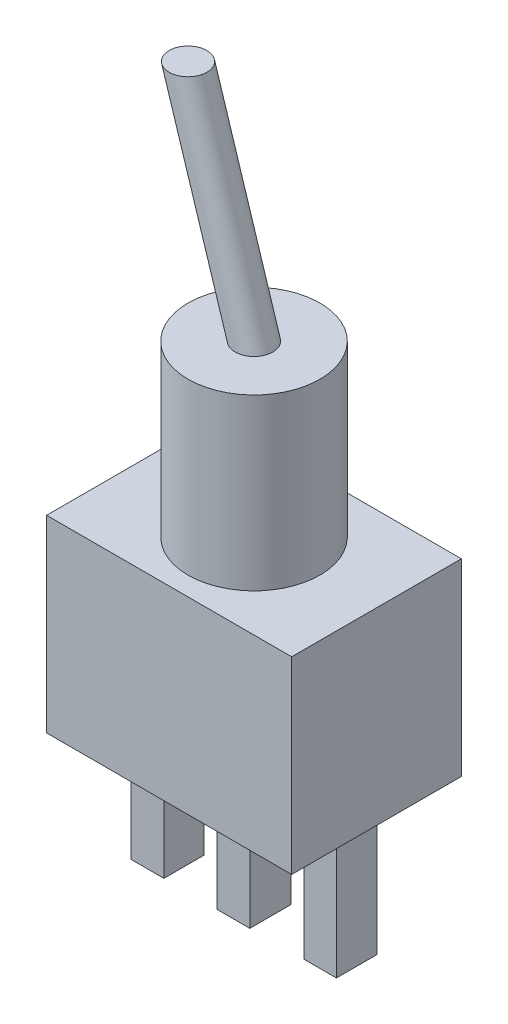
ISO-10303-21;
HEADER;
FILE_DESCRIPTION(('STEP AP214'),'2;1');
FILE_NAME('part.step','',(''),(''),'','','');
FILE_SCHEMA(('AUTOMOTIVE_DESIGN { 1 0 10303 214 1 1 1 1 }'));
ENDSEC;
DATA;
#1=APPLICATION_CONTEXT('core data for automotive mechanical design processes');
#2=APPLICATION_PROTOCOL_DEFINITION('international standard','automotive_design',2000,#1);
#3=PRODUCT_CONTEXT('',#1,'mechanical');
#4=PRODUCT('Part','Part','',(#3));
#5=PRODUCT_RELATED_PRODUCT_CATEGORY('part','',(#4));
#6=PRODUCT_DEFINITION_FORMATION('','',#4);
#7=PRODUCT_DEFINITION_CONTEXT('part definition',#1,'design');
#8=PRODUCT_DEFINITION('design','',#6,#7);
#9=PRODUCT_DEFINITION_SHAPE('','',#8);
#10=(LENGTH_UNIT() NAMED_UNIT(*) SI_UNIT(.MILLI.,.METRE.));
#11=(NAMED_UNIT(*) PLANE_ANGLE_UNIT() SI_UNIT($,.RADIAN.));
#12=(NAMED_UNIT(*) SI_UNIT($,.STERADIAN.) SOLID_ANGLE_UNIT());
#13=UNCERTAINTY_MEASURE_WITH_UNIT(LENGTH_MEASURE(1.E-05),#10,'distance_accuracy_value','');
#14=(GEOMETRIC_REPRESENTATION_CONTEXT(3) GLOBAL_UNCERTAINTY_ASSIGNED_CONTEXT((#13)) GLOBAL_UNIT_ASSIGNED_CONTEXT((#10,
#11,#12)) REPRESENTATION_CONTEXT('',''));
#15=CARTESIAN_POINT('',(0.,0.,0.));
#16=DIRECTION('',(0.,0.,1.));
#17=DIRECTION('',(1.,0.,0.));
#18=AXIS2_PLACEMENT_3D('',#15,#16,#17);
#19=CARTESIAN_POINT('',(0.,0.,0.));
#20=DIRECTION('',(0.,1.,0.));
#21=DIRECTION('',(0.,0.,1.));
#22=AXIS2_PLACEMENT_3D('',#19,#20,#21);
#23=PLANE('',#22);
#24=DIRECTION('',(0.,0.,1.));
#25=VECTOR('',#24,1.);
#26=CARTESIAN_POINT('',(-3.71007204412239,0.,1.06976152914244));
#27=LINE('',#26,#25);
#28=CARTESIAN_POINT('',(-3.71007204412239,0.,-1.06976152914244));
#29=VERTEX_POINT('',#28);
#30=CARTESIAN_POINT('',(-3.71007204412239,0.,1.06976152914244));
#31=VERTEX_POINT('',#30);
#32=EDGE_CURVE('E171',#29,#31,#27,.T.);
#33=ORIENTED_EDGE('',*,*,#32,.F.);
#34=DIRECTION('',(1.,0.,0.));
#35=VECTOR('',#34,1.);
#36=CARTESIAN_POINT('',(-3.71007204412239,0.,-1.06976152914244));
#37=LINE('',#36,#35);
#38=CARTESIAN_POINT('',(-5.44316480419965,0.,-1.06976152914244));
#39=VERTEX_POINT('',#38);
#40=EDGE_CURVE('E184',#39,#29,#37,.T.);
#41=ORIENTED_EDGE('',*,*,#40,.F.);
#42=DIRECTION('',(0.,0.,-1.));
#43=VECTOR('',#42,1.);
#44=CARTESIAN_POINT('',(-5.44316480419965,0.,1.06976152914244));
#45=LINE('',#44,#43);
#46=CARTESIAN_POINT('',(-5.44316480419965,0.,1.06976152914244));
#47=VERTEX_POINT('',#46);
#48=EDGE_CURVE('E193',#47,#39,#45,.T.);
#49=ORIENTED_EDGE('',*,*,#48,.F.);
#50=DIRECTION('',(-1.,0.,0.));
#51=VECTOR('',#50,1.);
#52=CARTESIAN_POINT('',(-3.71007204412239,0.,1.06976152914244));
#53=LINE('',#52,#51);
#54=EDGE_CURVE('E174',#31,#47,#53,.T.);
#55=ORIENTED_EDGE('',*,*,#54,.F.);
#56=EDGE_LOOP('',(#33,#41,#49,#55));
#57=FACE_BOUND('',#56,.T.);
#58=DIRECTION('',(0.,0.,-1.));
#59=VECTOR('',#58,1.);
#60=CARTESIAN_POINT('',(6.5,0.,-4.5));
#61=LINE('',#60,#59);
#62=CARTESIAN_POINT('',(6.5,0.,4.5));
#63=VERTEX_POINT('',#62);
#64=CARTESIAN_POINT('',(6.5,0.,-4.5));
#65=VERTEX_POINT('',#64);
#66=EDGE_CURVE('E248',#63,#65,#61,.T.);
#67=ORIENTED_EDGE('',*,*,#66,.F.);
#68=DIRECTION('',(1.,0.,0.));
#69=VECTOR('',#68,1.);
#70=CARTESIAN_POINT('',(-6.5,0.,4.5));
#71=LINE('',#70,#69);
#72=CARTESIAN_POINT('',(-6.5,0.,4.5));
#73=VERTEX_POINT('',#72);
#74=EDGE_CURVE('E255',#73,#63,#71,.T.);
#75=ORIENTED_EDGE('',*,*,#74,.F.);
#76=DIRECTION('',(0.,0.,1.));
#77=VECTOR('',#76,1.);
#78=CARTESIAN_POINT('',(-6.5,0.,-4.5));
#79=LINE('',#78,#77);
#80=CARTESIAN_POINT('',(-6.5,0.,-4.5));
#81=VERTEX_POINT('',#80);
#82=EDGE_CURVE('E266',#81,#73,#79,.T.);
#83=ORIENTED_EDGE('',*,*,#82,.F.);
#84=DIRECTION('',(-1.,0.,0.));
#85=VECTOR('',#84,1.);
#86=CARTESIAN_POINT('',(-6.5,0.,-4.5));
#87=LINE('',#86,#85);
#88=EDGE_CURVE('E264',#65,#81,#87,.T.);
#89=ORIENTED_EDGE('',*,*,#88,.F.);
#90=EDGE_LOOP('',(#67,#75,#83,#89));
#91=FACE_BOUND('',#90,.T.);
#92=DIRECTION('',(0.,0.,1.));
#93=VECTOR('',#92,1.);
#94=CARTESIAN_POINT('',(5.44316480419965,0.,1.06976152914244));
#95=LINE('',#94,#93);
#96=CARTESIAN_POINT('',(5.44316480419965,0.,-1.06976152914244));
#97=VERTEX_POINT('',#96);
#98=CARTESIAN_POINT('',(5.44316480419965,0.,1.06976152914244));
#99=VERTEX_POINT('',#98);
#100=EDGE_CURVE('E209',#97,#99,#95,.T.);
#101=ORIENTED_EDGE('',*,*,#100,.F.);
#102=DIRECTION('',(1.,0.,0.));
#103=VECTOR('',#102,1.);
#104=CARTESIAN_POINT('',(3.71007204412239,0.,-1.06976152914244));
#105=LINE('',#104,#103);
#106=CARTESIAN_POINT('',(3.71007204412239,0.,-1.06976152914244));
#107=VERTEX_POINT('',#106);
#108=EDGE_CURVE('E214',#107,#97,#105,.T.);
#109=ORIENTED_EDGE('',*,*,#108,.F.);
#110=DIRECTION('',(0.,0.,-1.));
#111=VECTOR('',#110,1.);
#112=CARTESIAN_POINT('',(3.71007204412239,0.,1.06976152914244));
#113=LINE('',#112,#111);
#114=CARTESIAN_POINT('',(3.71007204412239,0.,1.06976152914244));
#115=VERTEX_POINT('',#114);
#116=EDGE_CURVE('E226',#115,#107,#113,.T.);
#117=ORIENTED_EDGE('',*,*,#116,.F.);
#118=DIRECTION('',(-1.,0.,0.));
#119=VECTOR('',#118,1.);
#120=CARTESIAN_POINT('',(3.71007204412239,0.,1.06976152914244));
#121=LINE('',#120,#119);
#122=EDGE_CURVE('E223',#99,#115,#121,.T.);
#123=ORIENTED_EDGE('',*,*,#122,.F.);
#124=EDGE_LOOP('',(#101,#109,#117,#123));
#125=FACE_BOUND('',#124,.T.);
#126=DIRECTION('',(0.,0.,1.));
#127=VECTOR('',#126,1.);
#128=CARTESIAN_POINT('',(0.864683341182707,0.,1.08737475153483));
#129=LINE('',#128,#127);
#130=CARTESIAN_POINT('',(0.864683341182707,0.,-1.08737475153483));
#131=VERTEX_POINT('',#130);
#132=CARTESIAN_POINT('',(0.864683341182707,0.,1.08737475153483));
#133=VERTEX_POINT('',#132);
#134=EDGE_CURVE('E170',#131,#133,#129,.T.);
#135=ORIENTED_EDGE('',*,*,#134,.F.);
#136=DIRECTION('',(1.,0.,0.));
#137=VECTOR('',#136,1.);
#138=CARTESIAN_POINT('',(-0.864683341182707,0.,-1.08737475153483));
#139=LINE('',#138,#137);
#140=CARTESIAN_POINT('',(-0.864683341182707,0.,-1.08737475153483));
#141=VERTEX_POINT('',#140);
#142=EDGE_CURVE('E167',#141,#131,#139,.T.);
#143=ORIENTED_EDGE('',*,*,#142,.F.);
#144=DIRECTION('',(0.,0.,-1.));
#145=VECTOR('',#144,1.);
#146=CARTESIAN_POINT('',(-0.864683341182707,0.,1.08737475153483));
#147=LINE('',#146,#145);
#148=CARTESIAN_POINT('',(-0.864683341182707,0.,1.08737475153483));
#149=VERTEX_POINT('',#148);
#150=EDGE_CURVE('E57',#149,#141,#147,.T.);
#151=ORIENTED_EDGE('',*,*,#150,.F.);
#152=DIRECTION('',(-1.,0.,0.));
#153=VECTOR('',#152,1.);
#154=CARTESIAN_POINT('',(-0.864683341182707,0.,1.08737475153483));
#155=LINE('',#154,#153);
#156=EDGE_CURVE('E52',#133,#149,#155,.T.);
#157=ORIENTED_EDGE('',*,*,#156,.F.);
#158=EDGE_LOOP('',(#135,#143,#151,#157));
#159=FACE_BOUND('',#158,.T.);
#160=ADVANCED_FACE('F35',(#57,#91,#125,#159),#23,.F.);
#161=CARTESIAN_POINT('',(6.5,10.,-4.5));
#162=DIRECTION('',(-1.,0.,0.));
#163=DIRECTION('',(0.,0.,1.));
#164=AXIS2_PLACEMENT_3D('',#161,#162,#163);
#165=PLANE('',#164);
#166=ORIENTED_EDGE('',*,*,#66,.T.);
#167=DIRECTION('',(0.,-1.,0.));
#168=VECTOR('',#167,1.);
#169=CARTESIAN_POINT('',(6.5,10.,-4.5));
#170=LINE('',#169,#168);
#171=CARTESIAN_POINT('',(6.5,10.,-4.5));
#172=VERTEX_POINT('',#171);
#173=EDGE_CURVE('E39',#172,#65,#170,.T.);
#174=ORIENTED_EDGE('',*,*,#173,.F.);
#175=DIRECTION('',(0.,0.,-1.));
#176=VECTOR('',#175,1.);
#177=CARTESIAN_POINT('',(6.5,10.,-4.5));
#178=LINE('',#177,#176);
#179=CARTESIAN_POINT('',(6.5,10.,4.5));
#180=VERTEX_POINT('',#179);
#181=EDGE_CURVE('E251',#180,#172,#178,.T.);
#182=ORIENTED_EDGE('',*,*,#181,.F.);
#183=DIRECTION('',(0.,-1.,0.));
#184=VECTOR('',#183,1.);
#185=CARTESIAN_POINT('',(6.5,10.,4.5));
#186=LINE('',#185,#184);
#187=EDGE_CURVE('E261',#180,#63,#186,.T.);
#188=ORIENTED_EDGE('',*,*,#187,.T.);
#189=EDGE_LOOP('',(#166,#174,#182,#188));
#190=FACE_BOUND('',#189,.T.);
#191=ADVANCED_FACE('F37',(#190),#165,.F.);
#192=CARTESIAN_POINT('',(-6.5,10.,-4.5));
#193=DIRECTION('',(0.,0.,1.));
#194=DIRECTION('',(1.,0.,0.));
#195=AXIS2_PLACEMENT_3D('',#192,#193,#194);
#196=PLANE('',#195);
#197=ORIENTED_EDGE('',*,*,#88,.T.);
#198=DIRECTION('',(0.,-1.,0.));
#199=VECTOR('',#198,1.);
#200=CARTESIAN_POINT('',(-6.5,10.,-4.5));
#201=LINE('',#200,#199);
#202=CARTESIAN_POINT('',(-6.5,10.,-4.5));
#203=VERTEX_POINT('',#202);
#204=EDGE_CURVE('E273',#203,#81,#201,.T.);
#205=ORIENTED_EDGE('',*,*,#204,.F.);
#206=DIRECTION('',(-1.,0.,0.));
#207=VECTOR('',#206,1.);
#208=CARTESIAN_POINT('',(-6.5,10.,-4.5));
#209=LINE('',#208,#207);
#210=EDGE_CURVE('E254',#172,#203,#209,.T.);
#211=ORIENTED_EDGE('',*,*,#210,.F.);
#212=ORIENTED_EDGE('',*,*,#173,.T.);
#213=EDGE_LOOP('',(#197,#205,#211,#212));
#214=FACE_BOUND('',#213,.T.);
#215=ADVANCED_FACE('F282',(#214),#196,.F.);
#216=CARTESIAN_POINT('',(-6.5,10.,-4.5));
#217=DIRECTION('',(1.,0.,0.));
#218=DIRECTION('',(0.,0.,-1.));
#219=AXIS2_PLACEMENT_3D('',#216,#217,#218);
#220=PLANE('',#219);
#221=ORIENTED_EDGE('',*,*,#82,.T.);
#222=DIRECTION('',(0.,-1.,0.));
#223=VECTOR('',#222,1.);
#224=CARTESIAN_POINT('',(-6.5,10.,4.5));
#225=LINE('',#224,#223);
#226=CARTESIAN_POINT('',(-6.5,10.,4.5));
#227=VERTEX_POINT('',#226);
#228=EDGE_CURVE('E271',#227,#73,#225,.T.);
#229=ORIENTED_EDGE('',*,*,#228,.F.);
#230=DIRECTION('',(0.,0.,1.));
#231=VECTOR('',#230,1.);
#232=CARTESIAN_POINT('',(-6.5,10.,-4.5));
#233=LINE('',#232,#231);
#234=EDGE_CURVE('E257',#203,#227,#233,.T.);
#235=ORIENTED_EDGE('',*,*,#234,.F.);
#236=ORIENTED_EDGE('',*,*,#204,.T.);
#237=EDGE_LOOP('',(#221,#229,#235,#236));
#238=FACE_BOUND('',#237,.T.);
#239=ADVANCED_FACE('F291',(#238),#220,.F.);
#240=CARTESIAN_POINT('',(-6.5,10.,4.5));
#241=DIRECTION('',(0.,0.,-1.));
#242=DIRECTION('',(-1.,0.,0.));
#243=AXIS2_PLACEMENT_3D('',#240,#241,#242);
#244=PLANE('',#243);
#245=ORIENTED_EDGE('',*,*,#74,.T.);
#246=ORIENTED_EDGE('',*,*,#187,.F.);
#247=DIRECTION('',(1.,0.,0.));
#248=VECTOR('',#247,1.);
#249=CARTESIAN_POINT('',(-6.5,10.,4.5));
#250=LINE('',#249,#248);
#251=EDGE_CURVE('E259',#227,#180,#250,.T.);
#252=ORIENTED_EDGE('',*,*,#251,.F.);
#253=ORIENTED_EDGE('',*,*,#228,.T.);
#254=EDGE_LOOP('',(#245,#246,#252,#253));
#255=FACE_BOUND('',#254,.T.);
#256=ADVANCED_FACE('F294',(#255),#244,.F.);
#257=CARTESIAN_POINT('',(0.,10.,0.));
#258=DIRECTION('',(0.,1.,0.));
#259=DIRECTION('',(0.,0.,1.));
#260=AXIS2_PLACEMENT_3D('',#257,#258,#259);
#261=PLANE('',#260);
#262=CARTESIAN_POINT('',(0.,10.,0.));
#263=DIRECTION('',(0.,1.,0.));
#264=DIRECTION('',(0.,0.,1.));
#265=AXIS2_PLACEMENT_3D('',#262,#263,#264);
#266=CIRCLE('',#265,3.5);
#267=CARTESIAN_POINT('',(0.,10.,3.5));
#268=VERTEX_POINT('',#267);
#269=EDGE_CURVE('E44',#268,#268,#266,.T.);
#270=ORIENTED_EDGE('',*,*,#269,.F.);
#271=EDGE_LOOP('',(#270));
#272=FACE_BOUND('',#271,.T.);
#273=ORIENTED_EDGE('',*,*,#181,.T.);
#274=ORIENTED_EDGE('',*,*,#210,.T.);
#275=ORIENTED_EDGE('',*,*,#234,.T.);
#276=ORIENTED_EDGE('',*,*,#251,.T.);
#277=EDGE_LOOP('',(#273,#274,#275,#276));
#278=FACE_BOUND('',#277,.T.);
#279=ADVANCED_FACE('F296',(#272,#278),#261,.T.);
#280=CARTESIAN_POINT('',(0.,19.,0.));
#281=DIRECTION('',(0.,-1.,0.));
#282=DIRECTION('',(0.,0.,-1.));
#283=AXIS2_PLACEMENT_3D('',#280,#281,#282);
#284=CYLINDRICAL_SURFACE('',#283,3.5);
#285=CARTESIAN_POINT('',(0.,19.,0.));
#286=DIRECTION('',(0.,1.,0.));
#287=DIRECTION('',(0.,0.,1.));
#288=AXIS2_PLACEMENT_3D('',#285,#286,#287);
#289=CIRCLE('',#288,3.5);
#290=CARTESIAN_POINT('',(0.,19.,3.5));
#291=VERTEX_POINT('',#290);
#292=EDGE_CURVE('E245',#291,#291,#289,.T.);
#293=ORIENTED_EDGE('',*,*,#292,.F.);
#294=EDGE_LOOP('',(#293));
#295=FACE_BOUND('',#294,.T.);
#296=ORIENTED_EDGE('',*,*,#269,.T.);
#297=EDGE_LOOP('',(#296));
#298=FACE_BOUND('',#297,.T.);
#299=ADVANCED_FACE('F298',(#295,#298),#284,.T.);
#300=CARTESIAN_POINT('',(0.,19.,0.));
#301=DIRECTION('',(0.,1.,0.));
#302=DIRECTION('',(0.,0.,1.));
#303=AXIS2_PLACEMENT_3D('',#300,#301,#302);
#304=PLANE('',#303);
#305=CARTESIAN_POINT('',(0.,19.,0.));
#306=DIRECTION('',(0.,1.,0.));
#307=DIRECTION('',(0.,0.,1.));
#308=AXIS2_PLACEMENT_3D('',#305,#306,#307);
#309=CIRCLE('',#308,1.);
#310=CARTESIAN_POINT('',(0.,19.,1.));
#311=VERTEX_POINT('',#310);
#312=EDGE_CURVE('E11',#311,#311,#309,.T.);
#313=ORIENTED_EDGE('',*,*,#312,.F.);
#314=EDGE_LOOP('',(#313));
#315=FACE_BOUND('',#314,.T.);
#316=ORIENTED_EDGE('',*,*,#292,.T.);
#317=EDGE_LOOP('',(#316));
#318=FACE_BOUND('',#317,.T.);
#319=ADVANCED_FACE('F305',(#315,#318),#304,.T.);
#320=CARTESIAN_POINT('',(-3.5,30.1002056575858,0.));
#321=DIRECTION('',(0.,1.,0.));
#322=DIRECTION('',(0.,0.,1.));
#323=AXIS2_PLACEMENT_3D('',#320,#321,#322);
#324=PLANE('',#323);
#325=CARTESIAN_POINT('',(-3.5,30.1002056575858,0.));
#326=DIRECTION('',(0.,1.,0.));
#327=DIRECTION('',(0.,0.,1.));
#328=AXIS2_PLACEMENT_3D('',#325,#326,#327);
#329=CIRCLE('',#328,1.);
#330=CARTESIAN_POINT('',(-3.5,30.1002056575858,1.));
#331=VERTEX_POINT('',#330);
#332=EDGE_CURVE('E241',#331,#331,#329,.T.);
#333=ORIENTED_EDGE('',*,*,#332,.T.);
#334=EDGE_LOOP('',(#333));
#335=FACE_BOUND('',#334,.T.);
#336=ADVANCED_FACE('F352',(#335),#324,.T.);
#337=CARTESIAN_POINT('',(0.,19.,1.));
#338=CARTESIAN_POINT('',(-3.5,30.1002056575858,1.));
#339=CARTESIAN_POINT('',(2.,19.,1.));
#340=CARTESIAN_POINT('',(-1.5,30.1002056575858,1.));
#341=CARTESIAN_POINT('',(2.,19.,-1.));
#342=CARTESIAN_POINT('',(-1.5,30.1002056575858,-1.));
#343=CARTESIAN_POINT('',(0.,19.,-1.));
#344=CARTESIAN_POINT('',(-3.5,30.1002056575858,-1.));
#345=CARTESIAN_POINT('',(-2.,19.,-1.));
#346=CARTESIAN_POINT('',(-5.5,30.1002056575858,-1.));
#347=CARTESIAN_POINT('',(-2.,19.,1.));
#348=CARTESIAN_POINT('',(-5.5,30.1002056575858,1.));
#349=CARTESIAN_POINT('',(0.,19.,1.));
#350=CARTESIAN_POINT('',(-3.5,30.1002056575858,1.));
#351=(BOUNDED_SURFACE() B_SPLINE_SURFACE(3,1,((#337,#338),(#339,#340),(#341,#342),(#343,#344),
(#345,#346),(#347,#348),(#349,#350)),.UNSPECIFIED.,.T.,.F.,.F.) B_SPLINE_SURFACE_WITH_KNOTS((4,
3,4),(2,2),(0.,0.5,1.),(0.,1.),
.UNSPECIFIED.) GEOMETRIC_REPRESENTATION_ITEM() RATIONAL_B_SPLINE_SURFACE(((1.,1.),
(0.333333333333333,0.333333333333333),(0.333333333333333,0.333333333333333),(1.,1.),
(0.333333333333333,0.333333333333333),(0.333333333333333,0.333333333333333),(1.,1.))) REPRESENTATION_ITEM('') SURFACE());
#352=CARTESIAN_POINT('',(-3.5,30.1002056575858,1.));
#353=CARTESIAN_POINT('',(-3.46354166666667,29.9845785153193,1.));
#354=CARTESIAN_POINT('',(-3.42708333333333,29.8689513730528,1.));
#355=CARTESIAN_POINT('',(-3.35416666666667,29.6376970885198,1.));
#356=CARTESIAN_POINT('',(-3.31770833333333,29.5220699462532,1.));
#357=CARTESIAN_POINT('',(-3.24479166666667,29.2908156617202,1.));
#358=CARTESIAN_POINT('',(-3.20833333333333,29.1751885194537,1.));
#359=CARTESIAN_POINT('',(-3.13541666666667,28.9439342349206,1.));
#360=CARTESIAN_POINT('',(-3.09895833333333,28.8283070926541,1.));
#361=CARTESIAN_POINT('',(-3.02604166666667,28.5970528081211,1.));
#362=CARTESIAN_POINT('',(-2.98958333333333,28.4814256658546,1.));
#363=CARTESIAN_POINT('',(-2.91666666666667,28.2501713813215,1.));
#364=CARTESIAN_POINT('',(-2.88020833333333,28.134544239055,1.));
#365=CARTESIAN_POINT('',(-2.80729166666667,27.903289954522,1.));
#366=CARTESIAN_POINT('',(-2.77083333333333,27.7876628122555,1.));
#367=CARTESIAN_POINT('',(-2.69791666666667,27.5564085277224,1.));
#368=CARTESIAN_POINT('',(-2.66145833333333,27.4407813854559,1.));
#369=CARTESIAN_POINT('',(-2.58854166666667,27.2095271009229,1.));
#370=CARTESIAN_POINT('',(-2.55208333333333,27.0938999586563,1.));
#371=CARTESIAN_POINT('',(-2.47916666666667,26.8626456741233,1.));
#372=CARTESIAN_POINT('',(-2.44270833333333,26.7470185318568,1.));
#373=CARTESIAN_POINT('',(-2.36979166666667,26.5157642473237,1.));
#374=CARTESIAN_POINT('',(-2.33333333333333,26.4001371050572,1.));
#375=CARTESIAN_POINT('',(-2.26041666666667,26.1688828205242,1.));
#376=CARTESIAN_POINT('',(-2.22395833333333,26.0532556782577,1.));
#377=CARTESIAN_POINT('',(-2.15104166666667,25.8220013937246,1.));
#378=CARTESIAN_POINT('',(-2.11458333333333,25.7063742514581,1.));
#379=CARTESIAN_POINT('',(-2.04166666666667,25.4751199669251,1.));
#380=CARTESIAN_POINT('',(-2.00520833333333,25.3594928246586,1.));
#381=CARTESIAN_POINT('',(-1.93229166666667,25.1282385401255,1.));
#382=CARTESIAN_POINT('',(-1.89583333333333,25.012611397859,1.));
#383=CARTESIAN_POINT('',(-1.82291666666667,24.781357113326,1.));
#384=CARTESIAN_POINT('',(-1.78645833333333,24.6657299710594,1.));
#385=CARTESIAN_POINT('',(-1.71354166666667,24.4344756865264,1.));
#386=CARTESIAN_POINT('',(-1.67708333333333,24.3188485442599,1.));
#387=CARTESIAN_POINT('',(-1.60416666666667,24.0875942597268,1.));
#388=CARTESIAN_POINT('',(-1.56770833333333,23.9719671174603,1.));
#389=CARTESIAN_POINT('',(-1.49479166666667,23.7407128329273,1.));
#390=CARTESIAN_POINT('',(-1.45833333333333,23.6250856906608,1.));
#391=CARTESIAN_POINT('',(-1.38541666666667,23.3938314061277,1.));
#392=CARTESIAN_POINT('',(-1.34895833333333,23.2782042638612,1.));
#393=CARTESIAN_POINT('',(-1.27604166666667,23.0469499793282,1.));
#394=CARTESIAN_POINT('',(-1.23958333333333,22.9313228370616,1.));
#395=CARTESIAN_POINT('',(-1.16666666666667,22.7000685525286,1.));
#396=CARTESIAN_POINT('',(-1.13020833333333,22.5844414102621,1.));
#397=CARTESIAN_POINT('',(-1.05729166666667,22.3531871257291,1.));
#398=CARTESIAN_POINT('',(-1.02083333333333,22.2375599834625,1.));
#399=CARTESIAN_POINT('',(-0.947916666666666,22.0063056989295,1.));
#400=CARTESIAN_POINT('',(-0.911458333333333,21.890678556663,1.));
#401=CARTESIAN_POINT('',(-0.838541666666667,21.6594242721299,1.));
#402=CARTESIAN_POINT('',(-0.802083333333333,21.5437971298634,1.));
#403=CARTESIAN_POINT('',(-0.729166666666667,21.3125428453304,1.));
#404=CARTESIAN_POINT('',(-0.692708333333334,21.1969157030639,1.));
#405=CARTESIAN_POINT('',(-0.619791666666667,20.9656614185308,1.));
#406=CARTESIAN_POINT('',(-0.583333333333333,20.8500342762643,1.));
#407=CARTESIAN_POINT('',(-0.510416666666666,20.6187799917313,1.));
#408=CARTESIAN_POINT('',(-0.473958333333333,20.5031528494647,1.));
#409=CARTESIAN_POINT('',(-0.401041666666667,20.2718985649317,1.));
#410=CARTESIAN_POINT('',(-0.364583333333333,20.1562714226652,1.));
#411=CARTESIAN_POINT('',(-0.291666666666667,19.9250171381322,1.));
#412=CARTESIAN_POINT('',(-0.255208333333334,19.8093899958656,1.));
#413=CARTESIAN_POINT('',(-0.182291666666667,19.5781357113326,1.));
#414=CARTESIAN_POINT('',(-0.145833333333333,19.4625085690661,1.));
#415=CARTESIAN_POINT('',(-0.0729166666666664,19.231254284533,1.));
#416=CARTESIAN_POINT('',(-0.0364583333333329,19.1156271422665,1.));
#417=CARTESIAN_POINT('',(0.,19.,1.));
#418=B_SPLINE_CURVE_WITH_KNOTS('',3,(#352,#353,#354,#355,#356,#357,#358,#359,#360,#361,#362,
#363,#364,#365,#366,#367,#368,#369,#370,#371,#372,#373,#374,#375,#376,#377,#378,#379,#380,#381,
#382,#383,#384,#385,#386,#387,#388,#389,#390,#391,#392,#393,#394,#395,#396,#397,#398,#399,#400,
#401,#402,#403,#404,#405,#406,#407,#408,#409,#410,#411,#412,#413,#414,#415,#416,#417),
.UNSPECIFIED.,.F.,.F.,(4,2,2,2,2,2,2,2,2,2,2,2,2,2,2,2,2,2,2,2,2,2,2,2,2,2,2,2,2,2,2,2,4),(0.,
0.363716393476424,0.727432786952848,1.09114918042927,1.4548655739057,1.81858196738212,
2.18229836085854,2.54601475433496,2.90973114781139,3.27344754128781,3.63716393476424,
4.00088032824066,4.36459672171709,4.72831311519351,5.09202950866993,5.45574590214636,
5.81946229562278,6.18317868909921,6.54689508257563,6.91061147605205,7.27432786952848,
7.6380442630049,8.00176065648132,8.36547704995775,8.72919344343417,9.0929098369106,
9.45662623038702,9.82034262386344,10.1840590173399,10.5477754108163,10.9114918042927,
11.2752081977691,11.6389245912456),.UNSPECIFIED.);
#419=EDGE_CURVE('BSEAM355',#331,#311,#418,.T.);
#420=ORIENTED_EDGE('',*,*,#332,.F.);
#421=ORIENTED_EDGE('',*,*,#312,.T.);
#422=ORIENTED_EDGE('',*,*,#419,.T.);
#423=ORIENTED_EDGE('',*,*,#419,.F.);
#424=EDGE_LOOP('',(#420,#422,#421,#423));
#425=FACE_BOUND('',#424,.T.);
#426=ADVANCED_FACE('F355',(#425),#351,.T.);
#427=CARTESIAN_POINT('',(5.44316480419965,-7.,1.06976152914244));
#428=DIRECTION('',(-1.,0.,0.));
#429=DIRECTION('',(0.,0.,1.));
#430=AXIS2_PLACEMENT_3D('',#427,#428,#429);
#431=PLANE('',#430);
#432=ORIENTED_EDGE('',*,*,#100,.T.);
#433=DIRECTION('',(0.,1.,0.));
#434=VECTOR('',#433,1.);
#435=CARTESIAN_POINT('',(5.44316480419965,-7.,1.06976152914244));
#436=LINE('',#435,#434);
#437=CARTESIAN_POINT('',(5.44316480419965,-7.,1.06976152914244));
#438=VERTEX_POINT('',#437);
#439=EDGE_CURVE('E239',#438,#99,#436,.T.);
#440=ORIENTED_EDGE('',*,*,#439,.F.);
#441=DIRECTION('',(0.,0.,1.));
#442=VECTOR('',#441,1.);
#443=CARTESIAN_POINT('',(5.44316480419965,-7.,1.06976152914244));
#444=LINE('',#443,#442);
#445=CARTESIAN_POINT('',(5.44316480419965,-7.,-1.06976152914244));
#446=VERTEX_POINT('',#445);
#447=EDGE_CURVE('E210',#446,#438,#444,.T.);
#448=ORIENTED_EDGE('',*,*,#447,.F.);
#449=DIRECTION('',(0.,1.,0.));
#450=VECTOR('',#449,1.);
#451=CARTESIAN_POINT('',(5.44316480419965,-7.,-1.06976152914244));
#452=LINE('',#451,#450);
#453=EDGE_CURVE('E220',#446,#97,#452,.T.);
#454=ORIENTED_EDGE('',*,*,#453,.T.);
#455=EDGE_LOOP('',(#432,#440,#448,#454));
#456=FACE_BOUND('',#455,.T.);
#457=ADVANCED_FACE('F364',(#456),#431,.F.);
#458=CARTESIAN_POINT('',(3.71007204412239,-7.,1.06976152914244));
#459=DIRECTION('',(0.,0.,-1.));
#460=DIRECTION('',(-1.,0.,0.));
#461=AXIS2_PLACEMENT_3D('',#458,#459,#460);
#462=PLANE('',#461);
#463=ORIENTED_EDGE('',*,*,#122,.T.);
#464=DIRECTION('',(0.,1.,0.));
#465=VECTOR('',#464,1.);
#466=CARTESIAN_POINT('',(3.71007204412239,-7.,1.06976152914244));
#467=LINE('',#466,#465);
#468=CARTESIAN_POINT('',(3.71007204412239,-7.,1.06976152914244));
#469=VERTEX_POINT('',#468);
#470=EDGE_CURVE('E236',#469,#115,#467,.T.);
#471=ORIENTED_EDGE('',*,*,#470,.F.);
#472=DIRECTION('',(-1.,0.,0.));
#473=VECTOR('',#472,1.);
#474=CARTESIAN_POINT('',(3.71007204412239,-7.,1.06976152914244));
#475=LINE('',#474,#473);
#476=EDGE_CURVE('E213',#438,#469,#475,.T.);
#477=ORIENTED_EDGE('',*,*,#476,.F.);
#478=ORIENTED_EDGE('',*,*,#439,.T.);
#479=EDGE_LOOP('',(#463,#471,#477,#478));
#480=FACE_BOUND('',#479,.T.);
#481=ADVANCED_FACE('F384',(#480),#462,.F.);
#482=CARTESIAN_POINT('',(3.71007204412239,-7.,1.06976152914244));
#483=DIRECTION('',(1.,0.,0.));
#484=DIRECTION('',(0.,0.,-1.));
#485=AXIS2_PLACEMENT_3D('',#482,#483,#484);
#486=PLANE('',#485);
#487=ORIENTED_EDGE('',*,*,#116,.T.);
#488=DIRECTION('',(0.,1.,0.));
#489=VECTOR('',#488,1.);
#490=CARTESIAN_POINT('',(3.71007204412239,-7.,-1.06976152914244));
#491=LINE('',#490,#489);
#492=CARTESIAN_POINT('',(3.71007204412239,-7.,-1.06976152914244));
#493=VERTEX_POINT('',#492);
#494=EDGE_CURVE('E233',#493,#107,#491,.T.);
#495=ORIENTED_EDGE('',*,*,#494,.F.);
#496=DIRECTION('',(0.,0.,-1.));
#497=VECTOR('',#496,1.);
#498=CARTESIAN_POINT('',(3.71007204412239,-7.,1.06976152914244));
#499=LINE('',#498,#497);
#500=EDGE_CURVE('E216',#469,#493,#499,.T.);
#501=ORIENTED_EDGE('',*,*,#500,.F.);
#502=ORIENTED_EDGE('',*,*,#470,.T.);
#503=EDGE_LOOP('',(#487,#495,#501,#502));
#504=FACE_BOUND('',#503,.T.);
#505=ADVANCED_FACE('F391',(#504),#486,.F.);
#506=CARTESIAN_POINT('',(3.71007204412239,-7.,-1.06976152914244));
#507=DIRECTION('',(0.,0.,1.));
#508=DIRECTION('',(1.,0.,0.));
#509=AXIS2_PLACEMENT_3D('',#506,#507,#508);
#510=PLANE('',#509);
#511=ORIENTED_EDGE('',*,*,#108,.T.);
#512=ORIENTED_EDGE('',*,*,#453,.F.);
#513=DIRECTION('',(1.,0.,0.));
#514=VECTOR('',#513,1.);
#515=CARTESIAN_POINT('',(3.71007204412239,-7.,-1.06976152914244));
#516=LINE('',#515,#514);
#517=EDGE_CURVE('E218',#493,#446,#516,.T.);
#518=ORIENTED_EDGE('',*,*,#517,.F.);
#519=ORIENTED_EDGE('',*,*,#494,.T.);
#520=EDGE_LOOP('',(#511,#512,#518,#519));
#521=FACE_BOUND('',#520,.T.);
#522=ADVANCED_FACE('F399',(#521),#510,.F.);
#523=CARTESIAN_POINT('',(0.,-7.,0.));
#524=DIRECTION('',(0.,-1.,0.));
#525=DIRECTION('',(0.,0.,-1.));
#526=AXIS2_PLACEMENT_3D('',#523,#524,#525);
#527=PLANE('',#526);
#528=ORIENTED_EDGE('',*,*,#447,.T.);
#529=ORIENTED_EDGE('',*,*,#476,.T.);
#530=ORIENTED_EDGE('',*,*,#500,.T.);
#531=ORIENTED_EDGE('',*,*,#517,.T.);
#532=EDGE_LOOP('',(#528,#529,#530,#531));
#533=FACE_BOUND('',#532,.T.);
#534=ADVANCED_FACE('F407',(#533),#527,.T.);
#535=CARTESIAN_POINT('',(-3.71007204412239,-7.,1.06976152914244));
#536=DIRECTION('',(-1.,0.,0.));
#537=DIRECTION('',(0.,0.,1.));
#538=AXIS2_PLACEMENT_3D('',#535,#536,#537);
#539=PLANE('',#538);
#540=ORIENTED_EDGE('',*,*,#32,.T.);
#541=DIRECTION('',(0.,1.,0.));
#542=VECTOR('',#541,1.);
#543=CARTESIAN_POINT('',(-3.71007204412239,-7.,1.06976152914244));
#544=LINE('',#543,#542);
#545=CARTESIAN_POINT('',(-3.71007204412239,-7.,1.06976152914244));
#546=VERTEX_POINT('',#545);
#547=EDGE_CURVE('E206',#546,#31,#544,.T.);
#548=ORIENTED_EDGE('',*,*,#547,.F.);
#549=DIRECTION('',(0.,0.,1.));
#550=VECTOR('',#549,1.);
#551=CARTESIAN_POINT('',(-3.71007204412239,-7.,1.06976152914244));
#552=LINE('',#551,#550);
#553=CARTESIAN_POINT('',(-3.71007204412239,-7.,-1.06976152914244));
#554=VERTEX_POINT('',#553);
#555=EDGE_CURVE('E180',#554,#546,#552,.T.);
#556=ORIENTED_EDGE('',*,*,#555,.F.);
#557=DIRECTION('',(0.,1.,0.));
#558=VECTOR('',#557,1.);
#559=CARTESIAN_POINT('',(-3.71007204412239,-7.,-1.06976152914244));
#560=LINE('',#559,#558);
#561=EDGE_CURVE('E189',#554,#29,#560,.T.);
#562=ORIENTED_EDGE('',*,*,#561,.T.);
#563=EDGE_LOOP('',(#540,#548,#556,#562));
#564=FACE_BOUND('',#563,.T.);
#565=ADVANCED_FACE('F415',(#564),#539,.F.);
#566=CARTESIAN_POINT('',(-3.71007204412239,-7.,1.06976152914244));
#567=DIRECTION('',(0.,0.,-1.));
#568=DIRECTION('',(-1.,0.,0.));
#569=AXIS2_PLACEMENT_3D('',#566,#567,#568);
#570=PLANE('',#569);
#571=ORIENTED_EDGE('',*,*,#54,.T.);
#572=DIRECTION('',(0.,1.,0.));
#573=VECTOR('',#572,1.);
#574=CARTESIAN_POINT('',(-5.44316480419965,-7.,1.06976152914244));
#575=LINE('',#574,#573);
#576=CARTESIAN_POINT('',(-5.44316480419965,-7.,1.06976152914244));
#577=VERTEX_POINT('',#576);
#578=EDGE_CURVE('E203',#577,#47,#575,.T.);
#579=ORIENTED_EDGE('',*,*,#578,.F.);
#580=DIRECTION('',(-1.,0.,0.));
#581=VECTOR('',#580,1.);
#582=CARTESIAN_POINT('',(-3.71007204412239,-7.,1.06976152914244));
#583=LINE('',#582,#581);
#584=EDGE_CURVE('E183',#546,#577,#583,.T.);
#585=ORIENTED_EDGE('',*,*,#584,.F.);
#586=ORIENTED_EDGE('',*,*,#547,.T.);
#587=EDGE_LOOP('',(#571,#579,#585,#586));
#588=FACE_BOUND('',#587,.T.);
#589=ADVANCED_FACE('F423',(#588),#570,.F.);
#590=CARTESIAN_POINT('',(-5.44316480419965,-7.,1.06976152914244));
#591=DIRECTION('',(1.,0.,0.));
#592=DIRECTION('',(0.,0.,-1.));
#593=AXIS2_PLACEMENT_3D('',#590,#591,#592);
#594=PLANE('',#593);
#595=ORIENTED_EDGE('',*,*,#48,.T.);
#596=DIRECTION('',(0.,1.,0.));
#597=VECTOR('',#596,1.);
#598=CARTESIAN_POINT('',(-5.44316480419965,-7.,-1.06976152914244));
#599=LINE('',#598,#597);
#600=CARTESIAN_POINT('',(-5.44316480419965,-7.,-1.06976152914244));
#601=VERTEX_POINT('',#600);
#602=EDGE_CURVE('E200',#601,#39,#599,.T.);
#603=ORIENTED_EDGE('',*,*,#602,.F.);
#604=DIRECTION('',(0.,0.,-1.));
#605=VECTOR('',#604,1.);
#606=CARTESIAN_POINT('',(-5.44316480419965,-7.,1.06976152914244));
#607=LINE('',#606,#605);
#608=EDGE_CURVE('E186',#577,#601,#607,.T.);
#609=ORIENTED_EDGE('',*,*,#608,.F.);
#610=ORIENTED_EDGE('',*,*,#578,.T.);
#611=EDGE_LOOP('',(#595,#603,#609,#610));
#612=FACE_BOUND('',#611,.T.);
#613=ADVANCED_FACE('F431',(#612),#594,.F.);
#614=CARTESIAN_POINT('',(-3.71007204412239,-7.,-1.06976152914244));
#615=DIRECTION('',(0.,0.,1.));
#616=DIRECTION('',(1.,0.,0.));
#617=AXIS2_PLACEMENT_3D('',#614,#615,#616);
#618=PLANE('',#617);
#619=ORIENTED_EDGE('',*,*,#40,.T.);
#620=ORIENTED_EDGE('',*,*,#561,.F.);
#621=DIRECTION('',(1.,0.,0.));
#622=VECTOR('',#621,1.);
#623=CARTESIAN_POINT('',(-3.71007204412239,-7.,-1.06976152914244));
#624=LINE('',#623,#622);
#625=EDGE_CURVE('E188',#601,#554,#624,.T.);
#626=ORIENTED_EDGE('',*,*,#625,.F.);
#627=ORIENTED_EDGE('',*,*,#602,.T.);
#628=EDGE_LOOP('',(#619,#620,#626,#627));
#629=FACE_BOUND('',#628,.T.);
#630=ADVANCED_FACE('F439',(#629),#618,.F.);
#631=CARTESIAN_POINT('',(0.,-7.,0.));
#632=DIRECTION('',(0.,1.,0.));
#633=DIRECTION('',(0.,0.,1.));
#634=AXIS2_PLACEMENT_3D('',#631,#632,#633);
#635=PLANE('',#634);
#636=ORIENTED_EDGE('',*,*,#555,.T.);
#637=ORIENTED_EDGE('',*,*,#584,.T.);
#638=ORIENTED_EDGE('',*,*,#608,.T.);
#639=ORIENTED_EDGE('',*,*,#625,.T.);
#640=EDGE_LOOP('',(#636,#637,#638,#639));
#641=FACE_BOUND('',#640,.T.);
#642=ADVANCED_FACE('F447',(#641),#635,.F.);
#643=CARTESIAN_POINT('',(0.864683341182707,-7.,1.08737475153483));
#644=DIRECTION('',(-1.,0.,0.));
#645=DIRECTION('',(0.,0.,1.));
#646=AXIS2_PLACEMENT_3D('',#643,#644,#645);
#647=PLANE('',#646);
#648=ORIENTED_EDGE('',*,*,#134,.T.);
#649=DIRECTION('',(0.,1.,0.));
#650=VECTOR('',#649,1.);
#651=CARTESIAN_POINT('',(0.864683341182707,-7.,1.08737475153483));
#652=LINE('',#651,#650);
#653=CARTESIAN_POINT('',(0.864683341182707,-7.,1.08737475153483));
#654=VERTEX_POINT('',#653);
#655=EDGE_CURVE('E151',#654,#133,#652,.T.);
#656=ORIENTED_EDGE('',*,*,#655,.F.);
#657=DIRECTION('',(0.,0.,1.));
#658=VECTOR('',#657,1.);
#659=CARTESIAN_POINT('',(0.864683341182707,-7.,1.08737475153483));
#660=LINE('',#659,#658);
#661=CARTESIAN_POINT('',(0.864683341182707,-7.,-1.08737475153483));
#662=VERTEX_POINT('',#661);
#663=EDGE_CURVE('E158',#662,#654,#660,.T.);
#664=ORIENTED_EDGE('',*,*,#663,.F.);
#665=DIRECTION('',(0.,1.,0.));
#666=VECTOR('',#665,1.);
#667=CARTESIAN_POINT('',(0.864683341182707,-7.,-1.08737475153483));
#668=LINE('',#667,#666);
#669=EDGE_CURVE('E531',#662,#131,#668,.T.);
#670=ORIENTED_EDGE('',*,*,#669,.T.);
#671=EDGE_LOOP('',(#648,#656,#664,#670));
#672=FACE_BOUND('',#671,.T.);
#673=ADVANCED_FACE('F169',(#672),#647,.F.);
#674=CARTESIAN_POINT('',(-0.864683341182707,-7.,1.08737475153483));
#675=DIRECTION('',(0.,0.,-1.));
#676=DIRECTION('',(-1.,0.,0.));
#677=AXIS2_PLACEMENT_3D('',#674,#675,#676);
#678=PLANE('',#677);
#679=ORIENTED_EDGE('',*,*,#156,.T.);
#680=DIRECTION('',(0.,1.,0.));
#681=VECTOR('',#680,1.);
#682=CARTESIAN_POINT('',(-0.864683341182707,-7.,1.08737475153483));
#683=LINE('',#682,#681);
#684=CARTESIAN_POINT('',(-0.864683341182707,-7.,1.08737475153483));
#685=VERTEX_POINT('',#684);
#686=EDGE_CURVE('E154',#685,#149,#683,.T.);
#687=ORIENTED_EDGE('',*,*,#686,.F.);
#688=DIRECTION('',(-1.,0.,0.));
#689=VECTOR('',#688,1.);
#690=CARTESIAN_POINT('',(-0.864683341182707,-7.,1.08737475153483));
#691=LINE('',#690,#689);
#692=EDGE_CURVE('E147',#654,#685,#691,.T.);
#693=ORIENTED_EDGE('',*,*,#692,.F.);
#694=ORIENTED_EDGE('',*,*,#655,.T.);
#695=EDGE_LOOP('',(#679,#687,#693,#694));
#696=FACE_BOUND('',#695,.T.);
#697=ADVANCED_FACE('F149',(#696),#678,.F.);
#698=CARTESIAN_POINT('',(-0.864683341182707,-7.,1.08737475153483));
#699=DIRECTION('',(1.,0.,0.));
#700=DIRECTION('',(0.,0.,-1.));
#701=AXIS2_PLACEMENT_3D('',#698,#699,#700);
#702=PLANE('',#701);
#703=ORIENTED_EDGE('',*,*,#150,.T.);
#704=DIRECTION('',(0.,1.,0.));
#705=VECTOR('',#704,1.);
#706=CARTESIAN_POINT('',(-0.864683341182707,-7.,-1.08737475153483));
#707=LINE('',#706,#705);
#708=CARTESIAN_POINT('',(-0.864683341182707,-7.,-1.08737475153483));
#709=VERTEX_POINT('',#708);
#710=EDGE_CURVE('E176',#709,#141,#707,.T.);
#711=ORIENTED_EDGE('',*,*,#710,.F.);
#712=DIRECTION('',(0.,0.,-1.));
#713=VECTOR('',#712,1.);
#714=CARTESIAN_POINT('',(-0.864683341182707,-7.,1.08737475153483));
#715=LINE('',#714,#713);
#716=EDGE_CURVE('E157',#685,#709,#715,.T.);
#717=ORIENTED_EDGE('',*,*,#716,.F.);
#718=ORIENTED_EDGE('',*,*,#686,.T.);
#719=EDGE_LOOP('',(#703,#711,#717,#718));
#720=FACE_BOUND('',#719,.T.);
#721=ADVANCED_FACE('F468',(#720),#702,.F.);
#722=CARTESIAN_POINT('',(-0.864683341182707,-7.,-1.08737475153483));
#723=DIRECTION('',(0.,0.,1.));
#724=DIRECTION('',(1.,0.,0.));
#725=AXIS2_PLACEMENT_3D('',#722,#723,#724);
#726=PLANE('',#725);
#727=ORIENTED_EDGE('',*,*,#142,.T.);
#728=ORIENTED_EDGE('',*,*,#669,.F.);
#729=DIRECTION('',(1.,0.,0.));
#730=VECTOR('',#729,1.);
#731=CARTESIAN_POINT('',(-0.864683341182707,-7.,-1.08737475153483));
#732=LINE('',#731,#730);
#733=EDGE_CURVE('E163',#709,#662,#732,.T.);
#734=ORIENTED_EDGE('',*,*,#733,.F.);
#735=ORIENTED_EDGE('',*,*,#710,.T.);
#736=EDGE_LOOP('',(#727,#728,#734,#735));
#737=FACE_BOUND('',#736,.T.);
#738=ADVANCED_FACE('F475',(#737),#726,.F.);
#739=CARTESIAN_POINT('',(0.,-7.,0.));
#740=DIRECTION('',(0.,-1.,0.));
#741=DIRECTION('',(0.,0.,-1.));
#742=AXIS2_PLACEMENT_3D('',#739,#740,#741);
#743=PLANE('',#742);
#744=ORIENTED_EDGE('',*,*,#663,.T.);
#745=ORIENTED_EDGE('',*,*,#692,.T.);
#746=ORIENTED_EDGE('',*,*,#716,.T.);
#747=ORIENTED_EDGE('',*,*,#733,.T.);
#748=EDGE_LOOP('',(#744,#745,#746,#747));
#749=FACE_BOUND('',#748,.T.);
#750=ADVANCED_FACE('F161',(#749),#743,.T.);
#751=CLOSED_SHELL('',(#160,#191,#215,#239,#256,#279,#299,#319,#336,#426,#457,#481,#505,#522,
#534,#565,#589,#613,#630,#642,#673,#697,#721,#738,#750));
#752=MANIFOLD_SOLID_BREP('B2',#751);
#753=ADVANCED_BREP_SHAPE_REPRESENTATION('',(#18,#752),#14);
#754=SHAPE_DEFINITION_REPRESENTATION(#9,#753);
ENDSEC;
END-ISO-10303-21;
